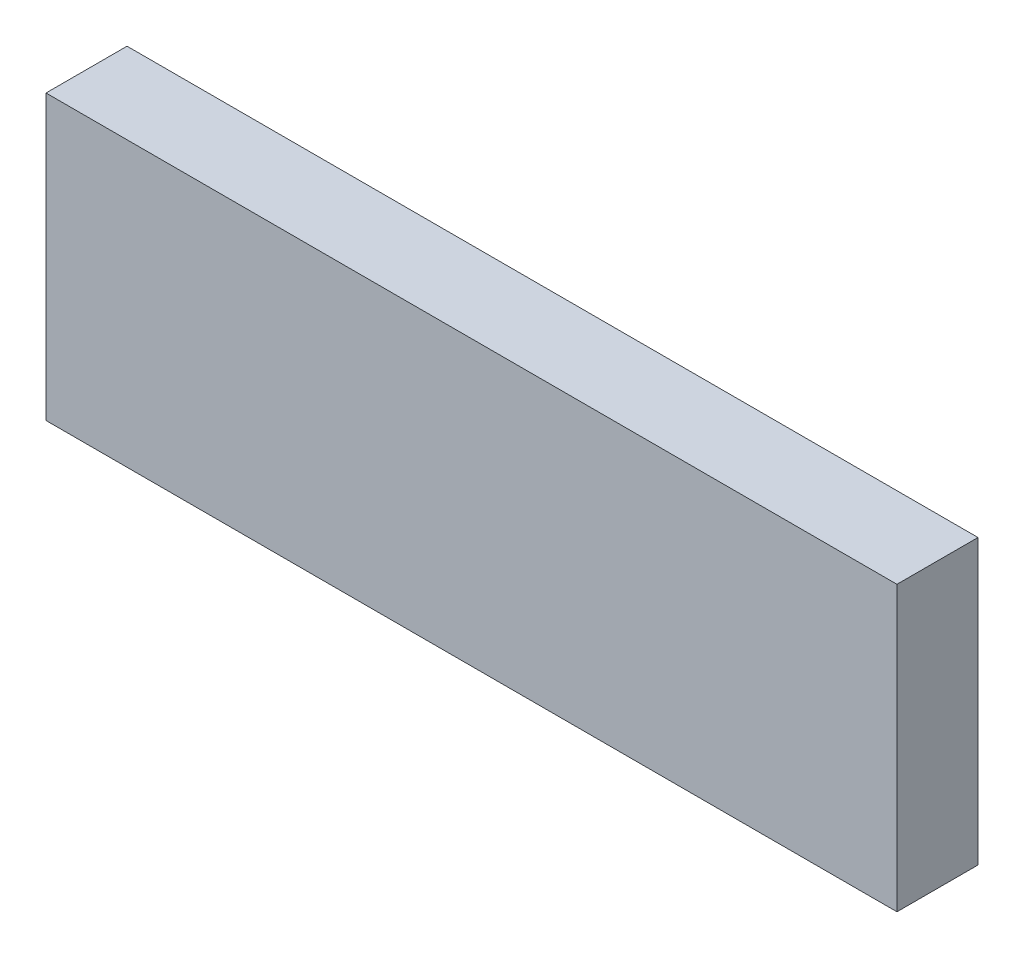
ISO-10303-21;
HEADER;
FILE_DESCRIPTION(('STEP AP214'),'2;1');
FILE_NAME('part.step','',(''),(''),'','','');
FILE_SCHEMA(('AUTOMOTIVE_DESIGN { 1 0 10303 214 1 1 1 1 }'));
ENDSEC;
DATA;
#1=APPLICATION_CONTEXT('core data for automotive mechanical design processes');
#2=APPLICATION_PROTOCOL_DEFINITION('international standard','automotive_design',2000,#1);
#3=PRODUCT_CONTEXT('',#1,'mechanical');
#4=PRODUCT('Part','Part','',(#3));
#5=PRODUCT_RELATED_PRODUCT_CATEGORY('part','',(#4));
#6=PRODUCT_DEFINITION_FORMATION('','',#4);
#7=PRODUCT_DEFINITION_CONTEXT('part definition',#1,'design');
#8=PRODUCT_DEFINITION('design','',#6,#7);
#9=PRODUCT_DEFINITION_SHAPE('','',#8);
#10=(LENGTH_UNIT() NAMED_UNIT(*) SI_UNIT(.MILLI.,.METRE.));
#11=(NAMED_UNIT(*) PLANE_ANGLE_UNIT() SI_UNIT($,.RADIAN.));
#12=(NAMED_UNIT(*) SI_UNIT($,.STERADIAN.) SOLID_ANGLE_UNIT());
#13=UNCERTAINTY_MEASURE_WITH_UNIT(LENGTH_MEASURE(1.E-05),#10,'distance_accuracy_value','');
#14=(GEOMETRIC_REPRESENTATION_CONTEXT(3) GLOBAL_UNCERTAINTY_ASSIGNED_CONTEXT((#13)) GLOBAL_UNIT_ASSIGNED_CONTEXT((#10,
#11,#12)) REPRESENTATION_CONTEXT('',''));
#15=CARTESIAN_POINT('',(0.,0.,0.));
#16=DIRECTION('',(0.,0.,1.));
#17=DIRECTION('',(1.,0.,0.));
#18=AXIS2_PLACEMENT_3D('',#15,#16,#17);
#19=CARTESIAN_POINT('',(105.,-35.,20.));
#20=DIRECTION('',(-1.,0.,0.));
#21=DIRECTION('',(0.,0.,1.));
#22=AXIS2_PLACEMENT_3D('',#19,#20,#21);
#23=PLANE('',#22);
#24=DIRECTION('',(0.,1.,0.));
#25=VECTOR('',#24,1.);
#26=CARTESIAN_POINT('',(105.,-35.,0.));
#27=LINE('',#26,#25);
#28=CARTESIAN_POINT('',(105.,-35.,0.));
#29=VERTEX_POINT('',#28);
#30=CARTESIAN_POINT('',(105.,35.,0.));
#31=VERTEX_POINT('',#30);
#32=EDGE_CURVE('E113',#29,#31,#27,.T.);
#33=ORIENTED_EDGE('',*,*,#32,.T.);
#34=DIRECTION('',(0.,0.,-1.));
#35=VECTOR('',#34,1.);
#36=CARTESIAN_POINT('',(105.,35.,20.));
#37=LINE('',#36,#35);
#38=CARTESIAN_POINT('',(105.,35.,20.));
#39=VERTEX_POINT('',#38);
#40=EDGE_CURVE('E11',#39,#31,#37,.T.);
#41=ORIENTED_EDGE('',*,*,#40,.F.);
#42=DIRECTION('',(0.,1.,0.));
#43=VECTOR('',#42,1.);
#44=CARTESIAN_POINT('',(105.,-35.,20.));
#45=LINE('',#44,#43);
#46=CARTESIAN_POINT('',(105.,-35.,20.));
#47=VERTEX_POINT('',#46);
#48=EDGE_CURVE('E97',#47,#39,#45,.T.);
#49=ORIENTED_EDGE('',*,*,#48,.F.);
#50=DIRECTION('',(0.,0.,-1.));
#51=VECTOR('',#50,1.);
#52=CARTESIAN_POINT('',(105.,-35.,20.));
#53=LINE('',#52,#51);
#54=EDGE_CURVE('E109',#47,#29,#53,.T.);
#55=ORIENTED_EDGE('',*,*,#54,.T.);
#56=EDGE_LOOP('',(#33,#41,#49,#55));
#57=FACE_BOUND('',#56,.T.);
#58=ADVANCED_FACE('F45',(#57),#23,.F.);
#59=CARTESIAN_POINT('',(-105.,35.,20.));
#60=DIRECTION('',(0.,-1.,0.));
#61=DIRECTION('',(0.,0.,-1.));
#62=AXIS2_PLACEMENT_3D('',#59,#60,#61);
#63=PLANE('',#62);
#64=DIRECTION('',(-1.,0.,0.));
#65=VECTOR('',#64,1.);
#66=CARTESIAN_POINT('',(-105.,35.,0.));
#67=LINE('',#66,#65);
#68=CARTESIAN_POINT('',(-105.,35.,0.));
#69=VERTEX_POINT('',#68);
#70=EDGE_CURVE('E102',#31,#69,#67,.T.);
#71=ORIENTED_EDGE('',*,*,#70,.T.);
#72=DIRECTION('',(0.,0.,-1.));
#73=VECTOR('',#72,1.);
#74=CARTESIAN_POINT('',(-105.,35.,20.));
#75=LINE('',#74,#73);
#76=CARTESIAN_POINT('',(-105.,35.,20.));
#77=VERTEX_POINT('',#76);
#78=EDGE_CURVE('E54',#77,#69,#75,.T.);
#79=ORIENTED_EDGE('',*,*,#78,.F.);
#80=DIRECTION('',(-1.,0.,0.));
#81=VECTOR('',#80,1.);
#82=CARTESIAN_POINT('',(-105.,35.,20.));
#83=LINE('',#82,#81);
#84=EDGE_CURVE('E92',#39,#77,#83,.T.);
#85=ORIENTED_EDGE('',*,*,#84,.F.);
#86=ORIENTED_EDGE('',*,*,#40,.T.);
#87=EDGE_LOOP('',(#71,#79,#85,#86));
#88=FACE_BOUND('',#87,.T.);
#89=ADVANCED_FACE('F101',(#88),#63,.F.);
#90=CARTESIAN_POINT('',(-105.,-35.,20.));
#91=DIRECTION('',(1.,0.,0.));
#92=DIRECTION('',(0.,0.,-1.));
#93=AXIS2_PLACEMENT_3D('',#90,#91,#92);
#94=PLANE('',#93);
#95=DIRECTION('',(0.,-1.,0.));
#96=VECTOR('',#95,1.);
#97=CARTESIAN_POINT('',(-105.,-35.,0.));
#98=LINE('',#97,#96);
#99=CARTESIAN_POINT('',(-105.,-35.,0.));
#100=VERTEX_POINT('',#99);
#101=EDGE_CURVE('E79',#69,#100,#98,.T.);
#102=ORIENTED_EDGE('',*,*,#101,.T.);
#103=DIRECTION('',(0.,0.,-1.));
#104=VECTOR('',#103,1.);
#105=CARTESIAN_POINT('',(-105.,-35.,20.));
#106=LINE('',#105,#104);
#107=CARTESIAN_POINT('',(-105.,-35.,20.));
#108=VERTEX_POINT('',#107);
#109=EDGE_CURVE('E104',#108,#100,#106,.T.);
#110=ORIENTED_EDGE('',*,*,#109,.F.);
#111=DIRECTION('',(0.,-1.,0.));
#112=VECTOR('',#111,1.);
#113=CARTESIAN_POINT('',(-105.,-35.,20.));
#114=LINE('',#113,#112);
#115=EDGE_CURVE('E95',#77,#108,#114,.T.);
#116=ORIENTED_EDGE('',*,*,#115,.F.);
#117=ORIENTED_EDGE('',*,*,#78,.T.);
#118=EDGE_LOOP('',(#102,#110,#116,#117));
#119=FACE_BOUND('',#118,.T.);
#120=ADVANCED_FACE('F105',(#119),#94,.F.);
#121=CARTESIAN_POINT('',(-105.,-35.,20.));
#122=DIRECTION('',(0.,1.,0.));
#123=DIRECTION('',(0.,0.,1.));
#124=AXIS2_PLACEMENT_3D('',#121,#122,#123);
#125=PLANE('',#124);
#126=DIRECTION('',(1.,0.,0.));
#127=VECTOR('',#126,1.);
#128=CARTESIAN_POINT('',(-105.,-35.,0.));
#129=LINE('',#128,#127);
#130=EDGE_CURVE('E85',#100,#29,#129,.T.);
#131=ORIENTED_EDGE('',*,*,#130,.T.);
#132=ORIENTED_EDGE('',*,*,#54,.F.);
#133=DIRECTION('',(1.,0.,0.));
#134=VECTOR('',#133,1.);
#135=CARTESIAN_POINT('',(-105.,-35.,20.));
#136=LINE('',#135,#134);
#137=EDGE_CURVE('E62',#108,#47,#136,.T.);
#138=ORIENTED_EDGE('',*,*,#137,.F.);
#139=ORIENTED_EDGE('',*,*,#109,.T.);
#140=EDGE_LOOP('',(#131,#132,#138,#139));
#141=FACE_BOUND('',#140,.T.);
#142=ADVANCED_FACE('F126',(#141),#125,.F.);
#143=CARTESIAN_POINT('',(0.,0.,20.));
#144=DIRECTION('',(0.,0.,-1.));
#145=DIRECTION('',(-1.,0.,0.));
#146=AXIS2_PLACEMENT_3D('',#143,#144,#145);
#147=PLANE('',#146);
#148=ORIENTED_EDGE('',*,*,#48,.T.);
#149=ORIENTED_EDGE('',*,*,#84,.T.);
#150=ORIENTED_EDGE('',*,*,#115,.T.);
#151=ORIENTED_EDGE('',*,*,#137,.T.);
#152=EDGE_LOOP('',(#148,#149,#150,#151));
#153=FACE_BOUND('',#152,.T.);
#154=ADVANCED_FACE('F93',(#153),#147,.F.);
#155=CARTESIAN_POINT('',(0.,0.,0.));
#156=DIRECTION('',(0.,0.,-1.));
#157=DIRECTION('',(-1.,0.,0.));
#158=AXIS2_PLACEMENT_3D('',#155,#156,#157);
#159=PLANE('',#158);
#160=ORIENTED_EDGE('',*,*,#32,.F.);
#161=ORIENTED_EDGE('',*,*,#130,.F.);
#162=ORIENTED_EDGE('',*,*,#101,.F.);
#163=ORIENTED_EDGE('',*,*,#70,.F.);
#164=EDGE_LOOP('',(#160,#161,#162,#163));
#165=FACE_BOUND('',#164,.T.);
#166=ADVANCED_FACE('F129',(#165),#159,.T.);
#167=CLOSED_SHELL('',(#58,#89,#120,#142,#154,#166));
#168=MANIFOLD_SOLID_BREP('B2',#167);
#169=ADVANCED_BREP_SHAPE_REPRESENTATION('',(#18,#168),#14);
#170=SHAPE_DEFINITION_REPRESENTATION(#9,#169);
ENDSEC;
END-ISO-10303-21;
